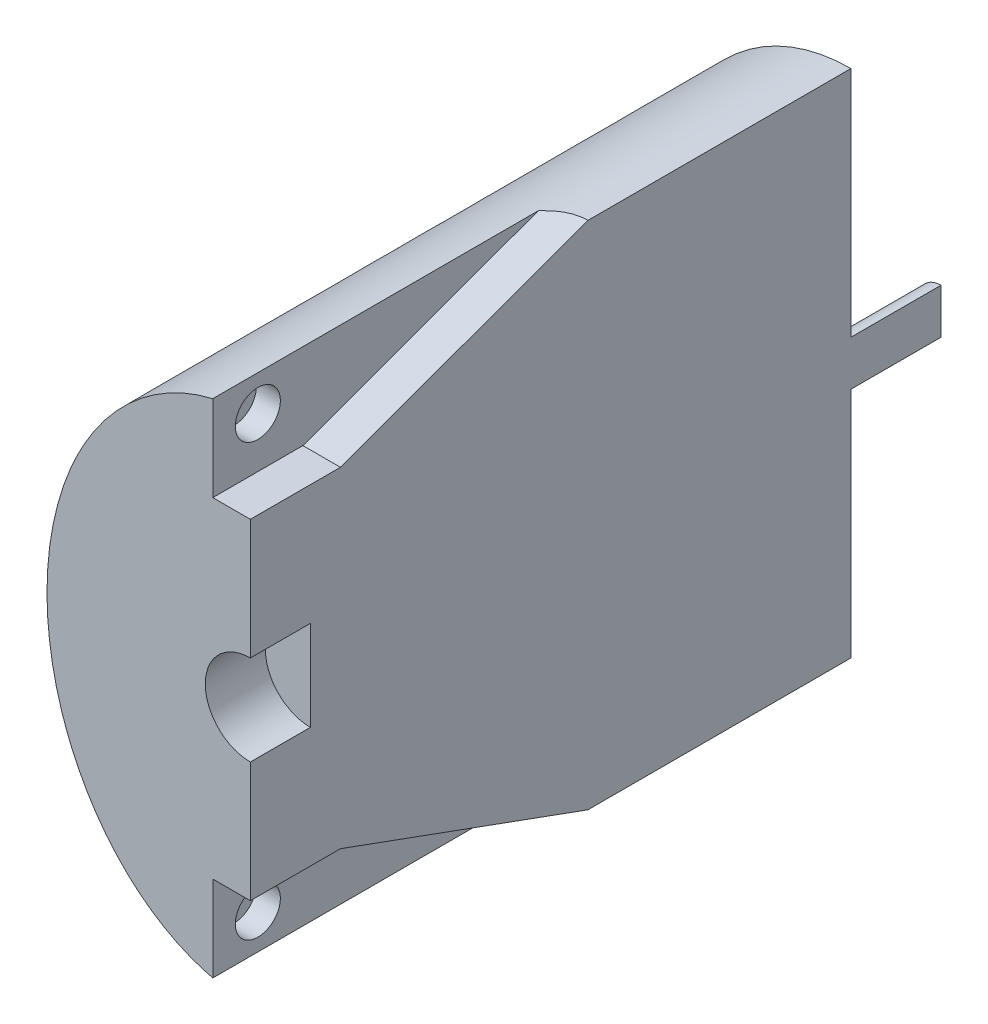
ISO-10303-21;
HEADER;
FILE_DESCRIPTION(('STEP AP214'),'2;1');
FILE_NAME('part.step','',(''),(''),'','','');
FILE_SCHEMA(('AUTOMOTIVE_DESIGN { 1 0 10303 214 1 1 1 1 }'));
ENDSEC;
DATA;
#1=APPLICATION_CONTEXT('core data for automotive mechanical design processes');
#2=APPLICATION_PROTOCOL_DEFINITION('international standard','automotive_design',2000,#1);
#3=PRODUCT_CONTEXT('',#1,'mechanical');
#4=PRODUCT('Part','Part','',(#3));
#5=PRODUCT_RELATED_PRODUCT_CATEGORY('part','',(#4));
#6=PRODUCT_DEFINITION_FORMATION('','',#4);
#7=PRODUCT_DEFINITION_CONTEXT('part definition',#1,'design');
#8=PRODUCT_DEFINITION('design','',#6,#7);
#9=PRODUCT_DEFINITION_SHAPE('','',#8);
#10=(LENGTH_UNIT() NAMED_UNIT(*) SI_UNIT(.MILLI.,.METRE.));
#11=(NAMED_UNIT(*) PLANE_ANGLE_UNIT() SI_UNIT($,.RADIAN.));
#12=(NAMED_UNIT(*) SI_UNIT($,.STERADIAN.) SOLID_ANGLE_UNIT());
#13=UNCERTAINTY_MEASURE_WITH_UNIT(LENGTH_MEASURE(1.E-05),#10,'distance_accuracy_value','');
#14=(GEOMETRIC_REPRESENTATION_CONTEXT(3) GLOBAL_UNCERTAINTY_ASSIGNED_CONTEXT((#13)) GLOBAL_UNIT_ASSIGNED_CONTEXT((#10,
#11,#12)) REPRESENTATION_CONTEXT('',''));
#15=CARTESIAN_POINT('',(0.,0.,0.));
#16=DIRECTION('',(0.,0.,1.));
#17=DIRECTION('',(1.,0.,0.));
#18=AXIS2_PLACEMENT_3D('',#15,#16,#17);
#19=CARTESIAN_POINT('',(-171.829854235586,137.159885705898,100.));
#20=DIRECTION('',(0.,1.,0.));
#21=DIRECTION('',(-1.,0.,0.));
#22=AXIS2_PLACEMENT_3D('',#19,#20,#21);
#23=PLANE('',#22);
#24=DIRECTION('',(-1.,0.,0.));
#25=VECTOR('',#24,1.);
#26=CARTESIAN_POINT('',(-178.830577490545,137.159885705898,170.));
#27=LINE('',#26,#25);
#28=CARTESIAN_POINT('',(-171.829854235586,137.159885705898,170.));
#29=VERTEX_POINT('',#28);
#30=CARTESIAN_POINT('',(-178.830577490545,137.159885705898,170.));
#31=VERTEX_POINT('',#30);
#32=EDGE_CURVE('E352',#29,#31,#27,.T.);
#33=ORIENTED_EDGE('',*,*,#32,.T.);
#34=DIRECTION('',(0.,0.,1.));
#35=VECTOR('',#34,1.);
#36=CARTESIAN_POINT('',(-178.830577490545,137.159885705898,100.));
#37=LINE('',#36,#35);
#38=CARTESIAN_POINT('',(-178.830577490545,137.159885705898,100.));
#39=VERTEX_POINT('',#38);
#40=EDGE_CURVE('E374',#39,#31,#37,.T.);
#41=ORIENTED_EDGE('',*,*,#40,.F.);
#42=DIRECTION('',(-1.,0.,0.));
#43=VECTOR('',#42,1.);
#44=CARTESIAN_POINT('',(-171.829854235586,137.159885705898,100.));
#45=LINE('',#44,#43);
#46=CARTESIAN_POINT('',(-171.829854235586,137.159885705898,100.));
#47=VERTEX_POINT('',#46);
#48=EDGE_CURVE('E356',#47,#39,#45,.T.);
#49=ORIENTED_EDGE('',*,*,#48,.F.);
#50=DIRECTION('',(0.,0.,1.));
#51=VECTOR('',#50,1.);
#52=CARTESIAN_POINT('',(-171.829854235586,137.159885705898,100.));
#53=LINE('',#52,#51);
#54=EDGE_CURVE('E273',#47,#29,#53,.T.);
#55=ORIENTED_EDGE('',*,*,#54,.T.);
#56=EDGE_LOOP('',(#33,#41,#49,#55));
#57=FACE_BOUND('',#56,.T.);
#58=ADVANCED_FACE('F45',(#57),#23,.F.);
#59=CARTESIAN_POINT('',(-171.829854235586,137.159885705898,100.));
#60=DIRECTION('',(1.,0.,0.));
#61=DIRECTION('',(0.,1.,0.));
#62=AXIS2_PLACEMENT_3D('',#59,#60,#61);
#63=PLANE('',#62);
#64=DIRECTION('',(0.,1.,0.));
#65=VECTOR('',#64,1.);
#66=CARTESIAN_POINT('',(-171.829854235586,137.159885705898,170.));
#67=LINE('',#66,#65);
#68=CARTESIAN_POINT('',(-171.829854235585,57.1598857058981,170.));
#69=VERTEX_POINT('',#68);
#70=EDGE_CURVE('E392',#69,#29,#67,.T.);
#71=ORIENTED_EDGE('',*,*,#70,.T.);
#72=ORIENTED_EDGE('',*,*,#54,.F.);
#73=DIRECTION('',(0.,1.,0.));
#74=VECTOR('',#73,1.);
#75=CARTESIAN_POINT('',(-171.829854235586,137.159885705898,100.));
#76=LINE('',#75,#74);
#77=CARTESIAN_POINT('',(-171.829854235585,57.1598857058981,100.));
#78=VERTEX_POINT('',#77);
#79=EDGE_CURVE('E371',#78,#47,#76,.T.);
#80=ORIENTED_EDGE('',*,*,#79,.F.);
#81=DIRECTION('',(0.,0.,1.));
#82=VECTOR('',#81,1.);
#83=CARTESIAN_POINT('',(-171.829854235585,57.1598857058981,100.));
#84=LINE('',#83,#82);
#85=EDGE_CURVE('E279',#78,#69,#84,.T.);
#86=ORIENTED_EDGE('',*,*,#85,.T.);
#87=EDGE_LOOP('',(#71,#72,#80,#86));
#88=FACE_BOUND('',#87,.T.);
#89=ADVANCED_FACE('F239',(#88),#63,.F.);
#90=CARTESIAN_POINT('',(-171.829854235585,57.1598857058981,100.));
#91=DIRECTION('',(0.,-1.,0.));
#92=DIRECTION('',(1.,0.,0.));
#93=AXIS2_PLACEMENT_3D('',#90,#91,#92);
#94=PLANE('',#93);
#95=DIRECTION('',(1.,0.,0.));
#96=VECTOR('',#95,1.);
#97=CARTESIAN_POINT('',(-171.829854235585,57.1598857058981,170.));
#98=LINE('',#97,#96);
#99=CARTESIAN_POINT('',(-178.829854235586,57.1598857058981,170.));
#100=VERTEX_POINT('',#99);
#101=EDGE_CURVE('E224',#100,#69,#98,.T.);
#102=ORIENTED_EDGE('',*,*,#101,.T.);
#103=ORIENTED_EDGE('',*,*,#85,.F.);
#104=DIRECTION('',(1.,0.,0.));
#105=VECTOR('',#104,1.);
#106=CARTESIAN_POINT('',(-171.829854235585,57.1598857058981,100.));
#107=LINE('',#106,#105);
#108=CARTESIAN_POINT('',(-178.829854235586,57.1598857058981,100.));
#109=VERTEX_POINT('',#108);
#110=EDGE_CURVE('E367',#109,#78,#107,.T.);
#111=ORIENTED_EDGE('',*,*,#110,.F.);
#112=DIRECTION('',(0.,0.,1.));
#113=VECTOR('',#112,1.);
#114=CARTESIAN_POINT('',(-178.829854235586,57.1598857058981,100.));
#115=LINE('',#114,#113);
#116=EDGE_CURVE('E379',#109,#100,#115,.T.);
#117=ORIENTED_EDGE('',*,*,#116,.T.);
#118=EDGE_LOOP('',(#102,#103,#111,#117));
#119=FACE_BOUND('',#118,.T.);
#120=ADVANCED_FACE('F242',(#119),#94,.F.);
#121=CARTESIAN_POINT('',(-119.06755766464,97.1607366363261,200.));
#122=DIRECTION('',(0.,0.,1.));
#123=DIRECTION('',(0.,1.,0.));
#124=AXIS2_PLACEMENT_3D('',#121,#122,#123);
#125=ELLIPSE('',#124,85.,67.7310126304816);
#126=DIRECTION('',(0.,0.,-1.));
#127=VECTOR('',#126,1.);
#128=SURFACE_OF_LINEAR_EXTRUSION('',#125,#127);
#129=DIRECTION('',(0.,0.,-1.));
#130=VECTOR('',#129,1.);
#131=CARTESIAN_POINT('',(-119.06755766464,12.1607366363261,200.));
#132=LINE('',#131,#130);
#133=CARTESIAN_POINT('',(-119.06755766464,12.1607366363261,0.));
#134=VERTEX_POINT('',#133);
#135=CARTESIAN_POINT('',(-119.06755766464,12.1607366363261,87.5756774163625));
#136=VERTEX_POINT('',#135);
#137=EDGE_CURVE('E318',#134,#136,#132,.F.);
#138=ORIENTED_EDGE('',*,*,#137,.T.);
#139=CARTESIAN_POINT('',(-119.06755766464,12.1607366363261,87.5756774163624));
#140=CARTESIAN_POINT('',(-119.383586371391,12.1607269743041,87.5756508701753));
#141=CARTESIAN_POINT('',(-119.699606928819,12.1635120796674,87.5833028842718));
#142=CARTESIAN_POINT('',(-120.330386248987,12.1745940688486,87.6137503993096));
#143=CARTESIAN_POINT('',(-120.645146149445,12.1828833655154,87.6365250547249));
#144=CARTESIAN_POINT('',(-121.272806244133,12.2048884158748,87.6969834337012));
#145=CARTESIAN_POINT('',(-121.58570761543,12.2186002533916,87.734656397658));
#146=CARTESIAN_POINT('',(-122.209073116528,12.2513143915793,87.8245377536256));
#147=CARTESIAN_POINT('',(-122.519537685847,12.2703157145573,87.8767434594474));
#148=CARTESIAN_POINT('',(-123.129914816455,12.3129151020833,87.9937843147577));
#149=CARTESIAN_POINT('',(-123.429900740831,12.3363905823088,88.058282666588));
#150=CARTESIAN_POINT('',(-124.026461234184,12.3880286439061,88.200157074811));
#151=CARTESIAN_POINT('',(-124.323035112724,12.4161921566786,88.2775356902061));
#152=CARTESIAN_POINT('',(-124.912266483196,12.4769903532572,88.4445773624493));
#153=CARTESIAN_POINT('',(-125.204923526619,12.5096255443775,88.5342418131319));
#154=CARTESIAN_POINT('',(-125.785845452512,12.5791267155634,88.7251947115907));
#155=CARTESIAN_POINT('',(-126.074111145622,12.6159919037848,88.8264809837931));
#156=CARTESIAN_POINT('',(-126.587683563335,12.6857913562401,89.0182534033041));
#157=CARTESIAN_POINT('',(-126.813843810091,12.7179946399888,89.1067311982359));
#158=CARTESIAN_POINT('',(-127.263054954301,12.784803058016,89.2902858181953));
#159=CARTESIAN_POINT('',(-127.486106487675,12.8194076921492,89.3853612690846));
#160=CARTESIAN_POINT('',(-127.929051556687,12.8909018996366,89.5817899897781));
#161=CARTESIAN_POINT('',(-128.148945106662,12.9277914626128,89.6831432310687));
#162=CARTESIAN_POINT('',(-128.585530158282,13.0037388597929,89.8918069898875));
#163=CARTESIAN_POINT('',(-128.802221362093,13.0427968940877,89.9991180571609));
#164=CARTESIAN_POINT('',(-129.236690343619,13.1237718465445,90.2215949105771));
#165=CARTESIAN_POINT('',(-129.454401379172,13.1657306223108,90.3368756995431));
#166=CARTESIAN_POINT('',(-129.886395896908,13.2516581011779,90.5729595074411));
#167=CARTESIAN_POINT('',(-130.100679460954,13.2956267561775,90.6937623942163));
#168=CARTESIAN_POINT('',(-130.525770455635,13.3854485573934,90.9405457648316));
#169=CARTESIAN_POINT('',(-130.736578681909,13.4313012636401,91.0665250398654));
#170=CARTESIAN_POINT('',(-131.154674432858,13.5247668609824,91.3233196580593));
#171=CARTESIAN_POINT('',(-131.361963765202,13.5723788057989,91.454132401339));
#172=CARTESIAN_POINT('',(-131.56755766464,13.6208278431604,91.5872450374838));
#173=B_SPLINE_CURVE_WITH_KNOTS('',3,(#139,#140,#141,#142,#143,#144,#145,#146,#147,#148,#149,
#150,#151,#152,#153,#154,#155,#156,#157,#158,#159,#160,#161,#162,#163,#164,#165,#166,#167,#168,
#169,#170,#171,#172),.UNSPECIFIED.,.F.,.F.,(4,2,2,2,2,2,2,2,2,2,2,2,2,2,2,2,4),(0.,
0.947968183888677,1.89463236363266,2.8406141045016,3.78642110886955,4.70930268473407,
5.63236783456584,6.5555377934634,7.47853521849692,8.21334860418294,8.94800940204893,
9.68266686336519,10.4173922266177,11.1669851057402,11.9165600547174,12.6659609445032,
13.4149644442029),.UNSPECIFIED.);
#174=CARTESIAN_POINT('',(-131.56755766464,13.6208278431604,91.5872450374838));
#175=VERTEX_POINT('',#174);
#176=EDGE_CURVE('E63',#136,#175,#173,.T.);
#177=ORIENTED_EDGE('',*,*,#176,.T.);
#178=DIRECTION('',(0.,0.,1.));
#179=VECTOR('',#178,1.);
#180=CARTESIAN_POINT('',(-131.567557664639,13.6208278431604,170.));
#181=LINE('',#180,#179);
#182=CARTESIAN_POINT('',(-131.567557664639,13.6208278431604,200.));
#183=VERTEX_POINT('',#182);
#184=EDGE_CURVE('E173',#175,#183,#181,.T.);
#185=ORIENTED_EDGE('',*,*,#184,.T.);
#186=CARTESIAN_POINT('',(-178.829854235586,57.1598857058981,200.));
#187=VERTEX_POINT('',#186);
#188=EDGE_CURVE('E277',#187,#183,#125,.T.);
#189=ORIENTED_EDGE('',*,*,#188,.F.);
#190=DIRECTION('',(0.,0.,1.));
#191=VECTOR('',#190,1.);
#192=CARTESIAN_POINT('',(-178.829854235586,57.1598857058981,170.));
#193=LINE('',#192,#191);
#194=EDGE_CURVE('E357',#100,#187,#193,.T.);
#195=ORIENTED_EDGE('',*,*,#194,.F.);
#196=ORIENTED_EDGE('',*,*,#116,.F.);
#197=CARTESIAN_POINT('',(-119.067557664642,97.1607366363261,100.));
#198=DIRECTION('',(0.,0.,1.));
#199=DIRECTION('',(0.,1.,0.));
#200=AXIS2_PLACEMENT_3D('',#197,#198,#199);
#201=ELLIPSE('',#200,85.,67.7310126304793);
#202=EDGE_CURVE('E363',#39,#109,#201,.T.);
#203=ORIENTED_EDGE('',*,*,#202,.F.);
#204=ORIENTED_EDGE('',*,*,#40,.T.);
#205=DIRECTION('',(0.,0.,1.));
#206=VECTOR('',#205,1.);
#207=CARTESIAN_POINT('',(-178.830577490545,137.159885705898,170.));
#208=LINE('',#207,#206);
#209=CARTESIAN_POINT('',(-178.830577490545,137.159885705898,200.));
#210=VERTEX_POINT('',#209);
#211=EDGE_CURVE('E353',#31,#210,#208,.T.);
#212=ORIENTED_EDGE('',*,*,#211,.T.);
#213=CARTESIAN_POINT('',(-131.567557664639,180.700645429492,200.));
#214=VERTEX_POINT('',#213);
#215=EDGE_CURVE('E272',#214,#210,#125,.T.);
#216=ORIENTED_EDGE('',*,*,#215,.F.);
#217=DIRECTION('',(0.,0.,1.));
#218=VECTOR('',#217,1.);
#219=CARTESIAN_POINT('',(-131.567557664639,180.700645429492,170.));
#220=LINE('',#219,#218);
#221=CARTESIAN_POINT('',(-131.56755766464,180.700645429492,91.5872450374839));
#222=VERTEX_POINT('',#221);
#223=EDGE_CURVE('E197',#222,#214,#220,.T.);
#224=ORIENTED_EDGE('',*,*,#223,.F.);
#225=CARTESIAN_POINT('',(-131.56755766464,180.700645429492,91.5872450374837));
#226=CARTESIAN_POINT('',(-131.306724735856,180.762111306917,91.4183689271923));
#227=CARTESIAN_POINT('',(-131.043157362125,180.822231762696,91.2531893324917));
#228=CARTESIAN_POINT('',(-130.51008740267,180.939653748451,90.9305750780804));
#229=CARTESIAN_POINT('',(-130.24057562193,180.996950392231,90.7731538430856));
#230=CARTESIAN_POINT('',(-129.695791932147,181.10843678294,90.4668475020349));
#231=CARTESIAN_POINT('',(-129.420515320268,181.162623846735,90.3179697678323));
#232=CARTESIAN_POINT('',(-128.864396990297,181.26760506454,90.0295362424459));
#233=CARTESIAN_POINT('',(-128.583554035488,181.318398453342,89.8899825536545));
#234=CARTESIAN_POINT('',(-128.023856562856,181.415045010467,89.6244483202874));
#235=CARTESIAN_POINT('',(-127.745141483009,181.460992521761,89.4982085705275));
#236=CARTESIAN_POINT('',(-127.182833274532,181.549152710296,89.2559904432326));
#237=CARTESIAN_POINT('',(-126.899242149697,181.591366879905,89.1400079654501));
#238=CARTESIAN_POINT('',(-126.327398202932,181.671818197351,88.9189697874021));
#239=CARTESIAN_POINT('',(-126.039147209277,181.710056863203,88.8139099164232));
#240=CARTESIAN_POINT('',(-125.45820279419,181.782325203805,88.6153542824771));
#241=CARTESIAN_POINT('',(-125.165510020367,181.816355485641,88.5218568515566));
#242=CARTESIAN_POINT('',(-124.638850278747,181.873194179337,88.3656938240741));
#243=CARTESIAN_POINT('',(-124.405661391106,181.896848557094,88.3007039553161));
#244=CARTESIAN_POINT('',(-123.936945804798,181.941299235826,88.1785767192215));
#245=CARTESIAN_POINT('',(-123.701418968515,181.962095367476,88.1214398171012));
#246=CARTESIAN_POINT('',(-123.228310491903,182.000723855262,88.0153089191594));
#247=CARTESIAN_POINT('',(-122.990728982987,182.018556399491,87.9663144065603));
#248=CARTESIAN_POINT('',(-122.513799905636,182.051165791568,87.876720838165));
#249=CARTESIAN_POINT('',(-122.274452497986,182.065942914144,87.8361210275654));
#250=CARTESIAN_POINT('',(-121.789318057084,182.092636764884,87.7627802754182));
#251=CARTESIAN_POINT('',(-121.54350017846,182.104488054412,87.7302191250476));
#252=CARTESIAN_POINT('',(-121.050662758767,182.124858477256,87.6742518482582));
#253=CARTESIAN_POINT('',(-120.803643110031,182.133377306236,87.6508465579966));
#254=CARTESIAN_POINT('',(-120.308723179732,182.147031409484,87.6133322176401));
#255=CARTESIAN_POINT('',(-120.060822637271,182.152165579507,87.5992262014348));
#256=CARTESIAN_POINT('',(-119.564468263533,182.159021094806,87.5803908279521));
#257=CARTESIAN_POINT('',(-119.316014187862,182.160740368137,87.5756671632951));
#258=CARTESIAN_POINT('',(-119.06755766464,182.160736636326,87.5756774163625));
#259=B_SPLINE_CURVE_WITH_KNOTS('',3,(#225,#226,#227,#228,#229,#230,#231,#232,#233,#234,#235,
#236,#237,#238,#239,#240,#241,#242,#243,#244,#245,#246,#247,#248,#249,#250,#251,#252,#253,#254,
#255,#256,#257,#258),.UNSPECIFIED.,.F.,.F.,(4,2,2,2,2,2,2,2,2,2,2,2,2,2,2,2,4),(0.,
0.950245393800601,1.90208113376269,2.8547261943208,3.80758533805188,4.73557311727297,
5.66318824941304,6.59044786778017,7.51757356680478,8.2471161507786,8.9767019348375,
9.70624139617153,10.4357152329571,11.1802674568051,11.9248876608763,12.6697506773447,
13.4150654919238),.UNSPECIFIED.);
#260=CARTESIAN_POINT('',(-119.06755766464,182.160736636326,87.5756774163625));
#261=VERTEX_POINT('',#260);
#262=EDGE_CURVE('E175',#222,#261,#259,.T.);
#263=ORIENTED_EDGE('',*,*,#262,.T.);
#264=DIRECTION('',(0.,0.,-1.));
#265=VECTOR('',#264,1.);
#266=CARTESIAN_POINT('',(-119.06755766464,182.160736636326,200.));
#267=LINE('',#266,#265);
#268=CARTESIAN_POINT('',(-119.06755766464,182.160736636326,0.));
#269=VERTEX_POINT('',#268);
#270=EDGE_CURVE('E331',#261,#269,#267,.T.);
#271=ORIENTED_EDGE('',*,*,#270,.T.);
#272=CARTESIAN_POINT('',(-119.06755766464,97.1607366363261,0.));
#273=DIRECTION('',(0.,0.,1.));
#274=DIRECTION('',(0.,1.,0.));
#275=AXIS2_PLACEMENT_3D('',#272,#273,#274);
#276=ELLIPSE('',#275,85.,67.7310126304816);
#277=EDGE_CURVE('E263',#269,#134,#276,.T.);
#278=ORIENTED_EDGE('',*,*,#277,.T.);
#279=EDGE_LOOP('',(#138,#177,#185,#189,#195,#196,#203,#204,#212,#216,#224,#263,#271,#278));
#280=FACE_BOUND('',#279,.T.);
#281=ADVANCED_FACE('F47',(#280),#128,.F.);
#282=CARTESIAN_POINT('',(-119.06755766464,97.1607366363261,200.));
#283=DIRECTION('',(0.,0.,1.));
#284=DIRECTION('',(1.,0.,0.));
#285=AXIS2_PLACEMENT_3D('',#282,#283,#284);
#286=PLANE('',#285);
#287=CARTESIAN_POINT('',(-119.06755766464,97.1607366363261,200.));
#288=DIRECTION('',(0.,0.,1.));
#289=DIRECTION('',(1.,0.,0.));
#290=AXIS2_PLACEMENT_3D('',#287,#288,#289);
#291=CIRCLE('',#290,15.);
#292=CARTESIAN_POINT('',(-119.06755766464,112.160736636326,200.));
#293=VERTEX_POINT('',#292);
#294=CARTESIAN_POINT('',(-119.06755766464,82.1607366363261,200.));
#295=VERTEX_POINT('',#294);
#296=EDGE_CURVE('E303',#293,#295,#291,.T.);
#297=ORIENTED_EDGE('',*,*,#296,.F.);
#298=DIRECTION('',(0.,-1.,0.));
#299=VECTOR('',#298,1.);
#300=CARTESIAN_POINT('',(-119.06755766464,202.479623117407,200.));
#301=LINE('',#300,#299);
#302=CARTESIAN_POINT('',(-119.06755766464,152.160736636326,200.));
#303=VERTEX_POINT('',#302);
#304=EDGE_CURVE('E306',#303,#293,#301,.T.);
#305=ORIENTED_EDGE('',*,*,#304,.F.);
#306=DIRECTION('',(1.,0.,0.));
#307=VECTOR('',#306,1.);
#308=CARTESIAN_POINT('',(-131.567557664639,152.160736636326,200.));
#309=LINE('',#308,#307);
#310=CARTESIAN_POINT('',(-131.567557664639,152.160736636326,200.));
#311=VERTEX_POINT('',#310);
#312=EDGE_CURVE('E205',#311,#303,#309,.T.);
#313=ORIENTED_EDGE('',*,*,#312,.F.);
#314=DIRECTION('',(0.,-1.,0.));
#315=VECTOR('',#314,1.);
#316=CARTESIAN_POINT('',(-131.567557664639,180.700645429492,200.));
#317=LINE('',#316,#315);
#318=EDGE_CURVE('E209',#214,#311,#317,.T.);
#319=ORIENTED_EDGE('',*,*,#318,.F.);
#320=ORIENTED_EDGE('',*,*,#215,.T.);
#321=CARTESIAN_POINT('',(-119.006227767719,97.0650549377999,200.));
#322=DIRECTION('',(0.,0.,1.));
#323=DIRECTION('',(-0.00277551775162049,0.999996148243187,0.));
#324=AXIS2_PLACEMENT_3D('',#321,#322,#323);
#325=ELLIPSE('',#324,85.0957262167493,67.7787396946028);
#326=EDGE_CURVE('E218',#210,#187,#325,.T.);
#327=ORIENTED_EDGE('',*,*,#326,.T.);
#328=ORIENTED_EDGE('',*,*,#188,.T.);
#329=DIRECTION('',(0.,-1.,0.));
#330=VECTOR('',#329,1.);
#331=CARTESIAN_POINT('',(-131.567557664639,42.1607366363261,200.));
#332=LINE('',#331,#330);
#333=CARTESIAN_POINT('',(-131.567557664639,42.1607366363261,200.));
#334=VERTEX_POINT('',#333);
#335=EDGE_CURVE('E185',#334,#183,#332,.T.);
#336=ORIENTED_EDGE('',*,*,#335,.F.);
#337=DIRECTION('',(-1.,0.,0.));
#338=VECTOR('',#337,1.);
#339=CARTESIAN_POINT('',(-131.567557664639,42.1607366363261,200.));
#340=LINE('',#339,#338);
#341=CARTESIAN_POINT('',(-119.06755766464,42.1607366363261,200.));
#342=VERTEX_POINT('',#341);
#343=EDGE_CURVE('E189',#342,#334,#340,.T.);
#344=ORIENTED_EDGE('',*,*,#343,.F.);
#345=EDGE_CURVE('E299',#295,#342,#301,.T.);
#346=ORIENTED_EDGE('',*,*,#345,.F.);
#347=EDGE_LOOP('',(#297,#305,#313,#319,#320,#327,#328,#336,#344,#346));
#348=FACE_BOUND('',#347,.T.);
#349=ADVANCED_FACE('F250',(#348),#286,.T.);
#350=CARTESIAN_POINT('',(-119.06755766464,97.1607366363261,0.));
#351=DIRECTION('',(0.,0.,1.));
#352=DIRECTION('',(1.,0.,0.));
#353=AXIS2_PLACEMENT_3D('',#350,#351,#352);
#354=PLANE('',#353);
#355=ORIENTED_EDGE('',*,*,#277,.F.);
#356=DIRECTION('',(0.,-1.,0.));
#357=VECTOR('',#356,1.);
#358=CARTESIAN_POINT('',(-119.06755766464,97.1607366363261,0.));
#359=LINE('',#358,#357);
#360=CARTESIAN_POINT('',(-119.06755766464,104.660736636326,0.));
#361=VERTEX_POINT('',#360);
#362=EDGE_CURVE('E266',#269,#361,#359,.T.);
#363=ORIENTED_EDGE('',*,*,#362,.T.);
#364=CARTESIAN_POINT('',(-119.06755766464,97.1607366363261,0.));
#365=DIRECTION('',(0.,0.,1.));
#366=DIRECTION('',(1.,0.,0.));
#367=AXIS2_PLACEMENT_3D('',#364,#365,#366);
#368=CIRCLE('',#367,7.50000000000001);
#369=CARTESIAN_POINT('',(-119.06755766464,89.6607366363261,0.));
#370=VERTEX_POINT('',#369);
#371=EDGE_CURVE('E284',#370,#361,#368,.F.);
#372=ORIENTED_EDGE('',*,*,#371,.F.);
#373=EDGE_CURVE('E268',#370,#134,#359,.T.);
#374=ORIENTED_EDGE('',*,*,#373,.T.);
#375=EDGE_LOOP('',(#355,#363,#372,#374));
#376=FACE_BOUND('',#375,.T.);
#377=ADVANCED_FACE('F237',(#376),#354,.F.);
#378=CARTESIAN_POINT('',(-119.067557664642,97.1607366363261,100.));
#379=DIRECTION('',(0.,0.,1.));
#380=DIRECTION('',(1.,0.,0.));
#381=AXIS2_PLACEMENT_3D('',#378,#379,#380);
#382=PLANE('',#381);
#383=ORIENTED_EDGE('',*,*,#48,.T.);
#384=ORIENTED_EDGE('',*,*,#202,.T.);
#385=ORIENTED_EDGE('',*,*,#110,.T.);
#386=ORIENTED_EDGE('',*,*,#79,.T.);
#387=EDGE_LOOP('',(#383,#384,#385,#386));
#388=FACE_BOUND('',#387,.T.);
#389=ADVANCED_FACE('F232',(#388),#382,.T.);
#390=CARTESIAN_POINT('',(-119.006227767719,97.0650549377999,170.));
#391=DIRECTION('',(0.,0.,1.));
#392=DIRECTION('',(-0.00277551775162049,0.999996148243187,0.));
#393=AXIS2_PLACEMENT_3D('',#390,#391,#392);
#394=ELLIPSE('',#393,85.0957262167493,67.7787396946028);
#395=DIRECTION('',(0.,0.,1.));
#396=VECTOR('',#395,1.);
#397=SURFACE_OF_LINEAR_EXTRUSION('',#394,#396);
#398=ORIENTED_EDGE('',*,*,#326,.F.);
#399=ORIENTED_EDGE('',*,*,#211,.F.);
#400=EDGE_CURVE('E219',#31,#100,#394,.T.);
#401=ORIENTED_EDGE('',*,*,#400,.T.);
#402=ORIENTED_EDGE('',*,*,#194,.T.);
#403=EDGE_LOOP('',(#398,#399,#401,#402));
#404=FACE_BOUND('',#403,.T.);
#405=ADVANCED_FACE('F227',(#404),#397,.T.);
#406=CARTESIAN_POINT('',(-119.006227767719,97.0650549377999,170.));
#407=DIRECTION('',(0.,0.,1.));
#408=DIRECTION('',(1.,0.,0.));
#409=AXIS2_PLACEMENT_3D('',#406,#407,#408);
#410=PLANE('',#409);
#411=ORIENTED_EDGE('',*,*,#400,.F.);
#412=ORIENTED_EDGE('',*,*,#32,.F.);
#413=ORIENTED_EDGE('',*,*,#70,.F.);
#414=ORIENTED_EDGE('',*,*,#101,.F.);
#415=EDGE_LOOP('',(#411,#412,#413,#414));
#416=FACE_BOUND('',#415,.T.);
#417=ADVANCED_FACE('F231',(#416),#410,.F.);
#418=CARTESIAN_POINT('',(-119.06755766464,97.1607366363261,-30.));
#419=DIRECTION('',(0.,0.,1.));
#420=DIRECTION('',(1.,0.,0.));
#421=AXIS2_PLACEMENT_3D('',#418,#419,#420);
#422=CYLINDRICAL_SURFACE('',#421,7.50000000000001);
#423=CARTESIAN_POINT('',(-119.06755766464,97.1607366363261,-30.));
#424=DIRECTION('',(0.,0.,-1.));
#425=DIRECTION('',(-1.,0.,0.));
#426=AXIS2_PLACEMENT_3D('',#423,#424,#425);
#427=CIRCLE('',#426,7.50000000000001);
#428=CARTESIAN_POINT('',(-119.06755766464,89.6607366363261,-30.));
#429=VERTEX_POINT('',#428);
#430=CARTESIAN_POINT('',(-119.06755766464,104.660736636326,-30.));
#431=VERTEX_POINT('',#430);
#432=EDGE_CURVE('E193',#429,#431,#427,.T.);
#433=ORIENTED_EDGE('',*,*,#432,.F.);
#434=DIRECTION('',(0.,0.,1.));
#435=VECTOR('',#434,1.);
#436=CARTESIAN_POINT('',(-119.06755766464,89.6607366363261,-30.));
#437=LINE('',#436,#435);
#438=EDGE_CURVE('E323',#429,#370,#437,.T.);
#439=ORIENTED_EDGE('',*,*,#438,.T.);
#440=ORIENTED_EDGE('',*,*,#371,.T.);
#441=DIRECTION('',(0.,0.,1.));
#442=VECTOR('',#441,1.);
#443=CARTESIAN_POINT('',(-119.06755766464,104.660736636326,-30.));
#444=LINE('',#443,#442);
#445=EDGE_CURVE('E204',#361,#431,#444,.F.);
#446=ORIENTED_EDGE('',*,*,#445,.T.);
#447=EDGE_LOOP('',(#433,#439,#440,#446));
#448=FACE_BOUND('',#447,.T.);
#449=ADVANCED_FACE('F397',(#448),#422,.T.);
#450=CARTESIAN_POINT('',(-119.06755766464,97.1607366363261,-30.));
#451=DIRECTION('',(0.,0.,-1.));
#452=DIRECTION('',(-1.,0.,0.));
#453=AXIS2_PLACEMENT_3D('',#450,#451,#452);
#454=PLANE('',#453);
#455=DIRECTION('',(0.,-1.,0.));
#456=VECTOR('',#455,1.);
#457=CARTESIAN_POINT('',(-119.06755766464,202.479623117407,-30.));
#458=LINE('',#457,#456);
#459=EDGE_CURVE('E310',#431,#429,#458,.T.);
#460=ORIENTED_EDGE('',*,*,#459,.T.);
#461=ORIENTED_EDGE('',*,*,#432,.T.);
#462=EDGE_LOOP('',(#460,#461));
#463=FACE_BOUND('',#462,.T.);
#464=ADVANCED_FACE('F400',(#463),#454,.T.);
#465=CARTESIAN_POINT('',(-131.567557664639,152.160736636326,170.));
#466=DIRECTION('',(0.,-1.,0.));
#467=DIRECTION('',(0.,0.,-1.));
#468=AXIS2_PLACEMENT_3D('',#465,#466,#467);
#469=PLANE('',#468);
#470=ORIENTED_EDGE('',*,*,#312,.T.);
#471=DIRECTION('',(0.,0.,-1.));
#472=VECTOR('',#471,1.);
#473=CARTESIAN_POINT('',(-119.06755766464,152.160736636326,170.));
#474=LINE('',#473,#472);
#475=CARTESIAN_POINT('',(-119.06755766464,152.160736636326,170.));
#476=VERTEX_POINT('',#475);
#477=EDGE_CURVE('E327',#303,#476,#474,.T.);
#478=ORIENTED_EDGE('',*,*,#477,.T.);
#479=DIRECTION('',(1.,0.,0.));
#480=VECTOR('',#479,1.);
#481=CARTESIAN_POINT('',(-131.567557664639,152.160736636326,170.));
#482=LINE('',#481,#480);
#483=CARTESIAN_POINT('',(-131.56755766464,152.160736636326,170.));
#484=VERTEX_POINT('',#483);
#485=EDGE_CURVE('E200',#484,#476,#482,.T.);
#486=ORIENTED_EDGE('',*,*,#485,.F.);
#487=DIRECTION('',(0.,0.,1.));
#488=VECTOR('',#487,1.);
#489=CARTESIAN_POINT('',(-131.567557664639,152.160736636326,170.));
#490=LINE('',#489,#488);
#491=EDGE_CURVE('E201',#484,#311,#490,.T.);
#492=ORIENTED_EDGE('',*,*,#491,.T.);
#493=EDGE_LOOP('',(#470,#478,#486,#492));
#494=FACE_BOUND('',#493,.T.);
#495=ADVANCED_FACE('F405',(#494),#469,.F.);
#496=CARTESIAN_POINT('',(-131.567557664639,180.700645429492,170.));
#497=DIRECTION('',(-1.,0.,0.));
#498=DIRECTION('',(0.,0.,1.));
#499=AXIS2_PLACEMENT_3D('',#496,#497,#498);
#500=PLANE('',#499);
#501=CARTESIAN_POINT('',(-131.567557664639,168.930691032909,185.));
#502=DIRECTION('',(1.,0.,0.));
#503=DIRECTION('',(0.,0.,-1.));
#504=AXIS2_PLACEMENT_3D('',#501,#502,#503);
#505=CIRCLE('',#504,7.50000000000001);
#506=CARTESIAN_POINT('',(-131.567557664639,168.930691032909,177.5));
#507=VERTEX_POINT('',#506);
#508=EDGE_CURVE('E474',#507,#507,#505,.T.);
#509=ORIENTED_EDGE('',*,*,#508,.F.);
#510=EDGE_LOOP('',(#509));
#511=FACE_BOUND('',#510,.T.);
#512=ORIENTED_EDGE('',*,*,#318,.T.);
#513=ORIENTED_EDGE('',*,*,#491,.F.);
#514=DIRECTION('',(0.,0.342020143325673,-0.939692620785907));
#515=VECTOR('',#514,1.);
#516=CARTESIAN_POINT('',(-131.56755766464,152.160736636326,170.));
#517=LINE('',#516,#515);
#518=EDGE_CURVE('E461',#484,#222,#517,.T.);
#519=ORIENTED_EDGE('',*,*,#518,.T.);
#520=ORIENTED_EDGE('',*,*,#223,.T.);
#521=EDGE_LOOP('',(#512,#513,#519,#520));
#522=FACE_BOUND('',#521,.T.);
#523=ADVANCED_FACE('F412',(#511,#522),#500,.F.);
#524=CARTESIAN_POINT('',(-131.567557664639,42.1607366363261,170.));
#525=DIRECTION('',(-1.,0.,0.));
#526=DIRECTION('',(0.,-1.,0.));
#527=AXIS2_PLACEMENT_3D('',#524,#525,#526);
#528=PLANE('',#527);
#529=CARTESIAN_POINT('',(-131.567557664639,25.3907822397431,185.));
#530=DIRECTION('',(1.,0.,0.));
#531=DIRECTION('',(0.,0.,-1.));
#532=AXIS2_PLACEMENT_3D('',#529,#530,#531);
#533=CIRCLE('',#532,7.50000000000001);
#534=CARTESIAN_POINT('',(-131.567557664639,25.3907822397431,177.5));
#535=VERTEX_POINT('',#534);
#536=EDGE_CURVE('E478',#535,#535,#533,.T.);
#537=ORIENTED_EDGE('',*,*,#536,.F.);
#538=EDGE_LOOP('',(#537));
#539=FACE_BOUND('',#538,.T.);
#540=ORIENTED_EDGE('',*,*,#335,.T.);
#541=ORIENTED_EDGE('',*,*,#184,.F.);
#542=DIRECTION('',(0.,0.342020143325673,0.939692620785907));
#543=VECTOR('',#542,1.);
#544=CARTESIAN_POINT('',(-131.56755766464,42.1607366363261,170.));
#545=LINE('',#544,#543);
#546=CARTESIAN_POINT('',(-131.56755766464,42.1607366363261,170.));
#547=VERTEX_POINT('',#546);
#548=EDGE_CURVE('E166',#175,#547,#545,.T.);
#549=ORIENTED_EDGE('',*,*,#548,.T.);
#550=DIRECTION('',(0.,0.,1.));
#551=VECTOR('',#550,1.);
#552=CARTESIAN_POINT('',(-131.567557664639,42.1607366363261,170.));
#553=LINE('',#552,#551);
#554=EDGE_CURVE('E170',#547,#334,#553,.T.);
#555=ORIENTED_EDGE('',*,*,#554,.T.);
#556=EDGE_LOOP('',(#540,#541,#549,#555));
#557=FACE_BOUND('',#556,.T.);
#558=ADVANCED_FACE('F168',(#539,#557),#528,.F.);
#559=CARTESIAN_POINT('',(-131.567557664639,42.1607366363261,170.));
#560=DIRECTION('',(0.,1.,0.));
#561=DIRECTION('',(-1.,0.,0.));
#562=AXIS2_PLACEMENT_3D('',#559,#560,#561);
#563=PLANE('',#562);
#564=DIRECTION('',(-1.,0.,0.));
#565=VECTOR('',#564,1.);
#566=CARTESIAN_POINT('',(-131.567557664639,42.1607366363261,170.));
#567=LINE('',#566,#565);
#568=CARTESIAN_POINT('',(-119.06755766464,42.1607366363261,170.));
#569=VERTEX_POINT('',#568);
#570=EDGE_CURVE('E179',#569,#547,#567,.T.);
#571=ORIENTED_EDGE('',*,*,#570,.F.);
#572=DIRECTION('',(0.,0.,1.));
#573=VECTOR('',#572,1.);
#574=CARTESIAN_POINT('',(-119.06755766464,42.1607366363261,170.));
#575=LINE('',#574,#573);
#576=EDGE_CURVE('E315',#569,#342,#575,.T.);
#577=ORIENTED_EDGE('',*,*,#576,.T.);
#578=ORIENTED_EDGE('',*,*,#343,.T.);
#579=ORIENTED_EDGE('',*,*,#554,.F.);
#580=EDGE_LOOP('',(#571,#577,#578,#579));
#581=FACE_BOUND('',#580,.T.);
#582=ADVANCED_FACE('F187',(#581),#563,.F.);
#583=CARTESIAN_POINT('',(-119.06755766464,202.479623117407,-30.));
#584=DIRECTION('',(-1.,0.,0.));
#585=DIRECTION('',(0.,0.,1.));
#586=AXIS2_PLACEMENT_3D('',#583,#584,#585);
#587=PLANE('',#586);
#588=ORIENTED_EDGE('',*,*,#576,.F.);
#589=DIRECTION('',(0.,-0.342020143325673,-0.939692620785907));
#590=VECTOR('',#589,1.);
#591=CARTESIAN_POINT('',(-119.06755766464,-3.36427714971471,44.9210526024941));
#592=LINE('',#591,#590);
#593=EDGE_CURVE('E11',#569,#136,#592,.T.);
#594=ORIENTED_EDGE('',*,*,#593,.T.);
#595=ORIENTED_EDGE('',*,*,#137,.F.);
#596=ORIENTED_EDGE('',*,*,#373,.F.);
#597=ORIENTED_EDGE('',*,*,#438,.F.);
#598=ORIENTED_EDGE('',*,*,#459,.F.);
#599=ORIENTED_EDGE('',*,*,#445,.F.);
#600=ORIENTED_EDGE('',*,*,#362,.F.);
#601=ORIENTED_EDGE('',*,*,#270,.F.);
#602=DIRECTION('',(0.,0.342020143325673,-0.939692620785907));
#603=VECTOR('',#602,1.);
#604=CARTESIAN_POINT('',(-119.06755766464,152.160736636326,170.));
#605=LINE('',#604,#603);
#606=EDGE_CURVE('E176',#476,#261,#605,.T.);
#607=ORIENTED_EDGE('',*,*,#606,.F.);
#608=ORIENTED_EDGE('',*,*,#477,.F.);
#609=ORIENTED_EDGE('',*,*,#304,.T.);
#610=DIRECTION('',(0.,0.,1.));
#611=VECTOR('',#610,1.);
#612=CARTESIAN_POINT('',(-119.06755766464,112.160736636326,180.));
#613=LINE('',#612,#611);
#614=CARTESIAN_POINT('',(-119.06755766464,112.160736636326,180.));
#615=VERTEX_POINT('',#614);
#616=EDGE_CURVE('E290',#293,#615,#613,.F.);
#617=ORIENTED_EDGE('',*,*,#616,.T.);
#618=DIRECTION('',(0.,1.,0.));
#619=VECTOR('',#618,1.);
#620=CARTESIAN_POINT('',(-119.06755766464,202.479623117407,180.));
#621=LINE('',#620,#619);
#622=CARTESIAN_POINT('',(-119.06755766464,82.1607366363261,180.));
#623=VERTEX_POINT('',#622);
#624=EDGE_CURVE('E287',#623,#615,#621,.T.);
#625=ORIENTED_EDGE('',*,*,#624,.F.);
#626=DIRECTION('',(0.,0.,1.));
#627=VECTOR('',#626,1.);
#628=CARTESIAN_POINT('',(-119.06755766464,82.1607366363261,180.));
#629=LINE('',#628,#627);
#630=EDGE_CURVE('E56',#623,#295,#629,.T.);
#631=ORIENTED_EDGE('',*,*,#630,.T.);
#632=ORIENTED_EDGE('',*,*,#345,.T.);
#633=EDGE_LOOP('',(#588,#594,#595,#596,#597,#598,#599,#600,#601,#607,#608,#609,#617,#625,#631,#632));
#634=FACE_BOUND('',#633,.T.);
#635=ADVANCED_FACE('F298',(#634),#587,.F.);
#636=CARTESIAN_POINT('',(-119.06755766464,97.1607366363261,180.));
#637=DIRECTION('',(0.,0.,1.));
#638=DIRECTION('',(1.,0.,0.));
#639=AXIS2_PLACEMENT_3D('',#636,#637,#638);
#640=CYLINDRICAL_SURFACE('',#639,15.);
#641=CARTESIAN_POINT('',(-119.06755766464,97.1607366363261,180.));
#642=DIRECTION('',(0.,0.,1.));
#643=DIRECTION('',(1.,0.,0.));
#644=AXIS2_PLACEMENT_3D('',#641,#642,#643);
#645=CIRCLE('',#644,15.);
#646=EDGE_CURVE('E69',#615,#623,#645,.T.);
#647=ORIENTED_EDGE('',*,*,#646,.F.);
#648=ORIENTED_EDGE('',*,*,#616,.F.);
#649=ORIENTED_EDGE('',*,*,#296,.T.);
#650=ORIENTED_EDGE('',*,*,#630,.F.);
#651=EDGE_LOOP('',(#647,#648,#649,#650));
#652=FACE_BOUND('',#651,.T.);
#653=ADVANCED_FACE('F424',(#652),#640,.F.);
#654=CARTESIAN_POINT('',(-119.06755766464,97.1607366363261,180.));
#655=DIRECTION('',(0.,0.,1.));
#656=DIRECTION('',(1.,0.,0.));
#657=AXIS2_PLACEMENT_3D('',#654,#655,#656);
#658=PLANE('',#657);
#659=ORIENTED_EDGE('',*,*,#624,.T.);
#660=ORIENTED_EDGE('',*,*,#646,.T.);
#661=EDGE_LOOP('',(#659,#660));
#662=FACE_BOUND('',#661,.T.);
#663=ADVANCED_FACE('F427',(#662),#658,.T.);
#664=CARTESIAN_POINT('',(-139.567557664639,25.3907822397431,185.));
#665=DIRECTION('',(1.,0.,0.));
#666=DIRECTION('',(0.,0.,-1.));
#667=AXIS2_PLACEMENT_3D('',#664,#665,#666);
#668=CYLINDRICAL_SURFACE('',#667,7.50000000000001);
#669=CARTESIAN_POINT('',(-139.567557664639,25.3907822397431,185.));
#670=DIRECTION('',(1.,0.,0.));
#671=DIRECTION('',(0.,0.,-1.));
#672=AXIS2_PLACEMENT_3D('',#669,#670,#671);
#673=CIRCLE('',#672,7.50000000000001);
#674=CARTESIAN_POINT('',(-139.567557664639,25.3907822397431,177.5));
#675=VERTEX_POINT('',#674);
#676=EDGE_CURVE('E469',#675,#675,#673,.T.);
#677=ORIENTED_EDGE('',*,*,#676,.F.);
#678=EDGE_LOOP('',(#677));
#679=FACE_BOUND('',#678,.T.);
#680=ORIENTED_EDGE('',*,*,#536,.T.);
#681=EDGE_LOOP('',(#680));
#682=FACE_BOUND('',#681,.T.);
#683=ADVANCED_FACE('F430',(#679,#682),#668,.F.);
#684=CARTESIAN_POINT('',(-139.567557664639,25.3907822397431,185.));
#685=DIRECTION('',(1.,0.,0.));
#686=DIRECTION('',(0.,0.,-1.));
#687=AXIS2_PLACEMENT_3D('',#684,#685,#686);
#688=PLANE('',#687);
#689=ORIENTED_EDGE('',*,*,#676,.T.);
#690=EDGE_LOOP('',(#689));
#691=FACE_BOUND('',#690,.T.);
#692=ADVANCED_FACE('F431',(#691),#688,.T.);
#693=CARTESIAN_POINT('',(-139.567557664639,168.930691032909,185.));
#694=DIRECTION('',(1.,0.,0.));
#695=DIRECTION('',(0.,0.,-1.));
#696=AXIS2_PLACEMENT_3D('',#693,#694,#695);
#697=CYLINDRICAL_SURFACE('',#696,7.50000000000001);
#698=CARTESIAN_POINT('',(-139.567557664639,168.930691032909,185.));
#699=DIRECTION('',(1.,0.,0.));
#700=DIRECTION('',(0.,0.,-1.));
#701=AXIS2_PLACEMENT_3D('',#698,#699,#700);
#702=CIRCLE('',#701,7.50000000000001);
#703=CARTESIAN_POINT('',(-139.567557664639,168.930691032909,177.5));
#704=VERTEX_POINT('',#703);
#705=EDGE_CURVE('E470',#704,#704,#702,.T.);
#706=ORIENTED_EDGE('',*,*,#705,.F.);
#707=EDGE_LOOP('',(#706));
#708=FACE_BOUND('',#707,.T.);
#709=ORIENTED_EDGE('',*,*,#508,.T.);
#710=EDGE_LOOP('',(#709));
#711=FACE_BOUND('',#710,.T.);
#712=ADVANCED_FACE('F434',(#708,#711),#697,.F.);
#713=CARTESIAN_POINT('',(-139.567557664639,168.930691032909,185.));
#714=DIRECTION('',(1.,0.,0.));
#715=DIRECTION('',(0.,0.,-1.));
#716=AXIS2_PLACEMENT_3D('',#713,#714,#715);
#717=PLANE('',#716);
#718=ORIENTED_EDGE('',*,*,#705,.T.);
#719=EDGE_LOOP('',(#718));
#720=FACE_BOUND('',#719,.T.);
#721=ADVANCED_FACE('F441',(#720),#717,.T.);
#722=CARTESIAN_POINT('',(-131.56755766464,152.160736636326,170.));
#723=DIRECTION('',(0.,-0.939692620785907,-0.342020143325673));
#724=DIRECTION('',(0.,0.342020143325673,-0.939692620785907));
#725=AXIS2_PLACEMENT_3D('',#722,#723,#724);
#726=PLANE('',#725);
#727=ORIENTED_EDGE('',*,*,#518,.F.);
#728=ORIENTED_EDGE('',*,*,#485,.T.);
#729=ORIENTED_EDGE('',*,*,#606,.T.);
#730=ORIENTED_EDGE('',*,*,#262,.F.);
#731=EDGE_LOOP('',(#727,#728,#729,#730));
#732=FACE_BOUND('',#731,.T.);
#733=ADVANCED_FACE('F445',(#732),#726,.F.);
#734=CARTESIAN_POINT('',(-131.56755766464,42.1607366363261,170.));
#735=DIRECTION('',(0.,0.939692620785907,-0.342020143325673));
#736=DIRECTION('',(0.,0.342020143325673,0.939692620785907));
#737=AXIS2_PLACEMENT_3D('',#734,#735,#736);
#738=PLANE('',#737);
#739=ORIENTED_EDGE('',*,*,#593,.F.);
#740=ORIENTED_EDGE('',*,*,#570,.T.);
#741=ORIENTED_EDGE('',*,*,#548,.F.);
#742=ORIENTED_EDGE('',*,*,#176,.F.);
#743=EDGE_LOOP('',(#739,#740,#741,#742));
#744=FACE_BOUND('',#743,.T.);
#745=ADVANCED_FACE('F180',(#744),#738,.F.);
#746=CLOSED_SHELL('',(#58,#89,#120,#281,#349,#377,#389,#405,#417,#449,#464,#495,#523,#558,#582,
#635,#653,#663,#683,#692,#712,#721,#733,#745));
#747=MANIFOLD_SOLID_BREP('B2',#746);
#748=ADVANCED_BREP_SHAPE_REPRESENTATION('',(#18,#747),#14);
#749=SHAPE_DEFINITION_REPRESENTATION(#9,#748);
ENDSEC;
END-ISO-10303-21;
